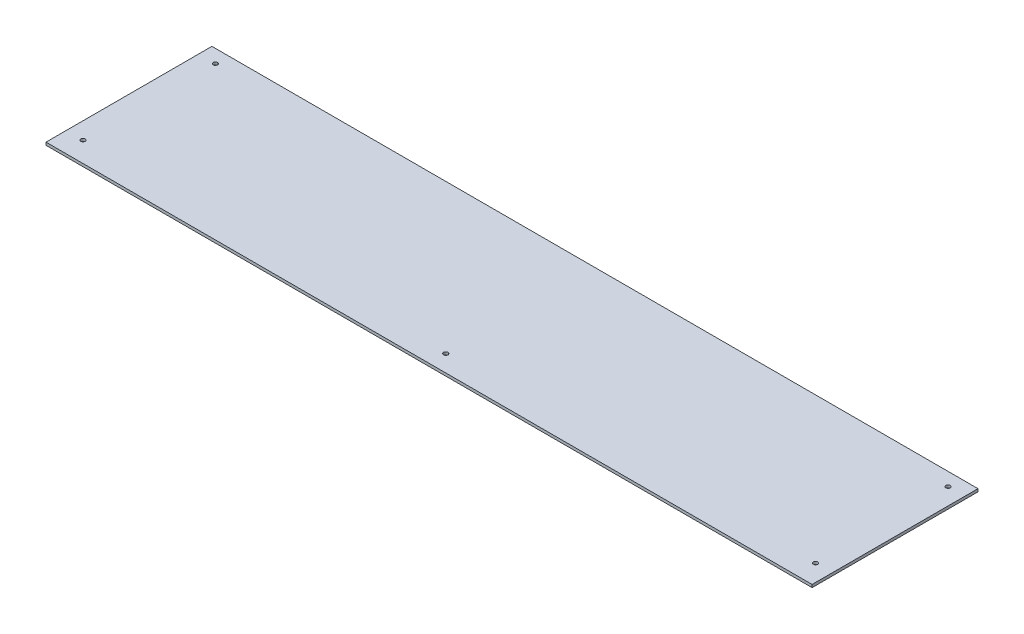
ISO-10303-21;
HEADER;
FILE_DESCRIPTION(('STEP AP214'),'2;1');
FILE_NAME('part.step','',(''),(''),'','','');
FILE_SCHEMA(('AUTOMOTIVE_DESIGN { 1 0 10303 214 1 1 1 1 }'));
ENDSEC;
DATA;
#1=APPLICATION_CONTEXT('core data for automotive mechanical design processes');
#2=APPLICATION_PROTOCOL_DEFINITION('international standard','automotive_design',2000,#1);
#3=PRODUCT_CONTEXT('',#1,'mechanical');
#4=PRODUCT('Part','Part','',(#3));
#5=PRODUCT_RELATED_PRODUCT_CATEGORY('part','',(#4));
#6=PRODUCT_DEFINITION_FORMATION('','',#4);
#7=PRODUCT_DEFINITION_CONTEXT('part definition',#1,'design');
#8=PRODUCT_DEFINITION('design','',#6,#7);
#9=PRODUCT_DEFINITION_SHAPE('','',#8);
#10=(LENGTH_UNIT() NAMED_UNIT(*) SI_UNIT(.MILLI.,.METRE.));
#11=(NAMED_UNIT(*) PLANE_ANGLE_UNIT() SI_UNIT($,.RADIAN.));
#12=(NAMED_UNIT(*) SI_UNIT($,.STERADIAN.) SOLID_ANGLE_UNIT());
#13=UNCERTAINTY_MEASURE_WITH_UNIT(LENGTH_MEASURE(1.E-05),#10,'distance_accuracy_value','');
#14=(GEOMETRIC_REPRESENTATION_CONTEXT(3) GLOBAL_UNCERTAINTY_ASSIGNED_CONTEXT((#13)) GLOBAL_UNIT_ASSIGNED_CONTEXT((#10,
#11,#12)) REPRESENTATION_CONTEXT('',''));
#15=CARTESIAN_POINT('',(0.,0.,0.));
#16=DIRECTION('',(0.,0.,1.));
#17=DIRECTION('',(1.,0.,0.));
#18=AXIS2_PLACEMENT_3D('',#15,#16,#17);
#19=CARTESIAN_POINT('',(0.,2.,0.));
#20=DIRECTION('',(0.,-1.,0.));
#21=DIRECTION('',(0.,0.,-1.));
#22=AXIS2_PLACEMENT_3D('',#19,#20,#21);
#23=PLANE('',#22);
#24=CARTESIAN_POINT('',(275.25,2.,-12.5));
#25=DIRECTION('',(0.,-1.,0.));
#26=DIRECTION('',(0.,0.,-1.));
#27=AXIS2_PLACEMENT_3D('',#24,#25,#26);
#28=CIRCLE('',#27,1.59999999999996);
#29=CARTESIAN_POINT('',(275.25,2.,-14.0999999999999));
#30=VERTEX_POINT('',#29);
#31=EDGE_CURVE('E101',#30,#30,#28,.F.);
#32=ORIENTED_EDGE('',*,*,#31,.F.);
#33=EDGE_LOOP('',(#32));
#34=FACE_BOUND('',#33,.T.);
#35=CARTESIAN_POINT('',(538.,2.,-110.));
#36=DIRECTION('',(0.,1.,0.));
#37=DIRECTION('',(0.,0.,-1.));
#38=AXIS2_PLACEMENT_3D('',#35,#36,#37);
#39=CIRCLE('',#38,1.54999999999999);
#40=CARTESIAN_POINT('',(538.,2.,-111.55));
#41=VERTEX_POINT('',#40);
#42=EDGE_CURVE('E111',#41,#41,#39,.T.);
#43=ORIENTED_EDGE('',*,*,#42,.F.);
#44=EDGE_LOOP('',(#43));
#45=FACE_BOUND('',#44,.T.);
#46=CARTESIAN_POINT('',(538.,2.,-15.));
#47=DIRECTION('',(0.,1.,0.));
#48=DIRECTION('',(0.,0.,-1.));
#49=AXIS2_PLACEMENT_3D('',#46,#47,#48);
#50=CIRCLE('',#49,1.54999999999999);
#51=CARTESIAN_POINT('',(538.,2.,-16.55));
#52=VERTEX_POINT('',#51);
#53=EDGE_CURVE('E119',#52,#52,#50,.T.);
#54=ORIENTED_EDGE('',*,*,#53,.F.);
#55=EDGE_LOOP('',(#54));
#56=FACE_BOUND('',#55,.T.);
#57=CARTESIAN_POINT('',(12.5,2.,-110.));
#58=DIRECTION('',(0.,1.,0.));
#59=DIRECTION('',(0.,0.,1.));
#60=AXIS2_PLACEMENT_3D('',#57,#58,#59);
#61=CIRCLE('',#60,1.54999999999999);
#62=CARTESIAN_POINT('',(12.5,2.,-108.45));
#63=VERTEX_POINT('',#62);
#64=EDGE_CURVE('E125',#63,#63,#61,.T.);
#65=ORIENTED_EDGE('',*,*,#64,.F.);
#66=EDGE_LOOP('',(#65));
#67=FACE_BOUND('',#66,.T.);
#68=CARTESIAN_POINT('',(12.5,2.,-15.));
#69=DIRECTION('',(0.,1.,0.));
#70=DIRECTION('',(0.,0.,1.));
#71=AXIS2_PLACEMENT_3D('',#68,#69,#70);
#72=CIRCLE('',#71,1.55);
#73=CARTESIAN_POINT('',(12.5,2.,-13.45));
#74=VERTEX_POINT('',#73);
#75=EDGE_CURVE('E11',#74,#74,#72,.T.);
#76=ORIENTED_EDGE('',*,*,#75,.F.);
#77=EDGE_LOOP('',(#76));
#78=FACE_BOUND('',#77,.T.);
#79=DIRECTION('',(1.,0.,0.));
#80=VECTOR('',#79,1.);
#81=CARTESIAN_POINT('',(550.,2.,-0.499999999999978));
#82=LINE('',#81,#80);
#83=CARTESIAN_POINT('',(0.500000000000056,2.,-0.5));
#84=VERTEX_POINT('',#83);
#85=CARTESIAN_POINT('',(550.,2.,-0.499999999999978));
#86=VERTEX_POINT('',#85);
#87=EDGE_CURVE('E83',#84,#86,#82,.T.);
#88=ORIENTED_EDGE('',*,*,#87,.T.);
#89=DIRECTION('',(0.,0.,-1.));
#90=VECTOR('',#89,1.);
#91=CARTESIAN_POINT('',(550.,2.,-119.5));
#92=LINE('',#91,#90);
#93=CARTESIAN_POINT('',(550.,2.,-119.5));
#94=VERTEX_POINT('',#93);
#95=EDGE_CURVE('E110',#86,#94,#92,.T.);
#96=ORIENTED_EDGE('',*,*,#95,.T.);
#97=DIRECTION('',(-1.,0.,0.));
#98=VECTOR('',#97,1.);
#99=CARTESIAN_POINT('',(0.5,2.,-119.5));
#100=LINE('',#99,#98);
#101=CARTESIAN_POINT('',(0.5,2.,-119.5));
#102=VERTEX_POINT('',#101);
#103=EDGE_CURVE('E166',#94,#102,#100,.T.);
#104=ORIENTED_EDGE('',*,*,#103,.T.);
#105=DIRECTION('',(0.,0.,1.));
#106=VECTOR('',#105,1.);
#107=CARTESIAN_POINT('',(0.5,2.,-0.5));
#108=LINE('',#107,#106);
#109=EDGE_CURVE('E118',#102,#84,#108,.T.);
#110=ORIENTED_EDGE('',*,*,#109,.T.);
#111=EDGE_LOOP('',(#88,#96,#104,#110));
#112=FACE_BOUND('',#111,.T.);
#113=ADVANCED_FACE('F39',(#34,#45,#56,#67,#78,#112),#23,.F.);
#114=CARTESIAN_POINT('',(0.,0.,0.));
#115=DIRECTION('',(0.,-1.,0.));
#116=DIRECTION('',(0.,0.,-1.));
#117=AXIS2_PLACEMENT_3D('',#114,#115,#116);
#118=PLANE('',#117);
#119=CARTESIAN_POINT('',(275.25,0.,-12.5));
#120=DIRECTION('',(0.,-1.,0.));
#121=DIRECTION('',(0.,0.,-1.));
#122=AXIS2_PLACEMENT_3D('',#119,#120,#121);
#123=CIRCLE('',#122,1.59999999999996);
#124=CARTESIAN_POINT('',(275.25,0.,-14.0999999999999));
#125=VERTEX_POINT('',#124);
#126=EDGE_CURVE('E172',#125,#125,#123,.T.);
#127=ORIENTED_EDGE('',*,*,#126,.F.);
#128=EDGE_LOOP('',(#127));
#129=FACE_BOUND('',#128,.T.);
#130=CARTESIAN_POINT('',(538.,0.,-110.));
#131=DIRECTION('',(0.,1.,0.));
#132=DIRECTION('',(0.,0.,-1.));
#133=AXIS2_PLACEMENT_3D('',#130,#131,#132);
#134=CIRCLE('',#133,1.54999999999999);
#135=CARTESIAN_POINT('',(538.,0.,-111.55));
#136=VERTEX_POINT('',#135);
#137=EDGE_CURVE('E115',#136,#136,#134,.T.);
#138=ORIENTED_EDGE('',*,*,#137,.T.);
#139=EDGE_LOOP('',(#138));
#140=FACE_BOUND('',#139,.T.);
#141=CARTESIAN_POINT('',(12.5,0.,-110.));
#142=DIRECTION('',(0.,1.,0.));
#143=DIRECTION('',(0.,0.,1.));
#144=AXIS2_PLACEMENT_3D('',#141,#142,#143);
#145=CIRCLE('',#144,1.54999999999999);
#146=CARTESIAN_POINT('',(12.5,0.,-108.45));
#147=VERTEX_POINT('',#146);
#148=EDGE_CURVE('E122',#147,#147,#145,.T.);
#149=ORIENTED_EDGE('',*,*,#148,.T.);
#150=EDGE_LOOP('',(#149));
#151=FACE_BOUND('',#150,.T.);
#152=CARTESIAN_POINT('',(12.5,0.,-15.));
#153=DIRECTION('',(0.,1.,0.));
#154=DIRECTION('',(0.,0.,1.));
#155=AXIS2_PLACEMENT_3D('',#152,#153,#154);
#156=CIRCLE('',#155,1.55);
#157=CARTESIAN_POINT('',(12.5,0.,-13.45));
#158=VERTEX_POINT('',#157);
#159=EDGE_CURVE('E43',#158,#158,#156,.T.);
#160=ORIENTED_EDGE('',*,*,#159,.T.);
#161=EDGE_LOOP('',(#160));
#162=FACE_BOUND('',#161,.T.);
#163=CARTESIAN_POINT('',(538.,0.,-15.));
#164=DIRECTION('',(0.,1.,0.));
#165=DIRECTION('',(0.,0.,-1.));
#166=AXIS2_PLACEMENT_3D('',#163,#164,#165);
#167=CIRCLE('',#166,1.54999999999999);
#168=CARTESIAN_POINT('',(538.,0.,-16.55));
#169=VERTEX_POINT('',#168);
#170=EDGE_CURVE('E114',#169,#169,#167,.T.);
#171=ORIENTED_EDGE('',*,*,#170,.T.);
#172=EDGE_LOOP('',(#171));
#173=FACE_BOUND('',#172,.T.);
#174=DIRECTION('',(0.,0.,1.));
#175=VECTOR('',#174,1.);
#176=CARTESIAN_POINT('',(550.,0.,-119.5));
#177=LINE('',#176,#175);
#178=CARTESIAN_POINT('',(550.,0.,-119.5));
#179=VERTEX_POINT('',#178);
#180=CARTESIAN_POINT('',(550.,0.,-0.499999999999978));
#181=VERTEX_POINT('',#180);
#182=EDGE_CURVE('E99',#179,#181,#177,.T.);
#183=ORIENTED_EDGE('',*,*,#182,.T.);
#184=DIRECTION('',(-1.,0.,0.));
#185=VECTOR('',#184,1.);
#186=CARTESIAN_POINT('',(550.,0.,-0.499999999999978));
#187=LINE('',#186,#185);
#188=CARTESIAN_POINT('',(0.5,0.,-0.5));
#189=VERTEX_POINT('',#188);
#190=EDGE_CURVE('E62',#181,#189,#187,.T.);
#191=ORIENTED_EDGE('',*,*,#190,.T.);
#192=DIRECTION('',(0.,0.,-1.));
#193=VECTOR('',#192,1.);
#194=CARTESIAN_POINT('',(0.5,0.,-0.5));
#195=LINE('',#194,#193);
#196=CARTESIAN_POINT('',(0.5,0.,-119.5));
#197=VERTEX_POINT('',#196);
#198=EDGE_CURVE('E90',#189,#197,#195,.T.);
#199=ORIENTED_EDGE('',*,*,#198,.T.);
#200=DIRECTION('',(1.,0.,0.));
#201=VECTOR('',#200,1.);
#202=CARTESIAN_POINT('',(0.5,0.,-119.5));
#203=LINE('',#202,#201);
#204=EDGE_CURVE('E96',#197,#179,#203,.T.);
#205=ORIENTED_EDGE('',*,*,#204,.T.);
#206=EDGE_LOOP('',(#183,#191,#199,#205));
#207=FACE_BOUND('',#206,.T.);
#208=ADVANCED_FACE('F41',(#129,#140,#151,#162,#173,#207),#118,.T.);
#209=CARTESIAN_POINT('',(12.5,2.,-15.));
#210=DIRECTION('',(0.,-1.,0.));
#211=DIRECTION('',(0.,0.,-1.));
#212=AXIS2_PLACEMENT_3D('',#209,#210,#211);
#213=CYLINDRICAL_SURFACE('',#212,1.55);
#214=ORIENTED_EDGE('',*,*,#75,.T.);
#215=EDGE_LOOP('',(#214));
#216=FACE_BOUND('',#215,.T.);
#217=ORIENTED_EDGE('',*,*,#159,.F.);
#218=EDGE_LOOP('',(#217));
#219=FACE_BOUND('',#218,.T.);
#220=ADVANCED_FACE('F136',(#216,#219),#213,.F.);
#221=CARTESIAN_POINT('',(12.5,2.,-110.));
#222=DIRECTION('',(0.,-1.,0.));
#223=DIRECTION('',(0.,0.,-1.));
#224=AXIS2_PLACEMENT_3D('',#221,#222,#223);
#225=CYLINDRICAL_SURFACE('',#224,1.54999999999999);
#226=ORIENTED_EDGE('',*,*,#64,.T.);
#227=EDGE_LOOP('',(#226));
#228=FACE_BOUND('',#227,.T.);
#229=ORIENTED_EDGE('',*,*,#148,.F.);
#230=EDGE_LOOP('',(#229));
#231=FACE_BOUND('',#230,.T.);
#232=ADVANCED_FACE('F133',(#228,#231),#225,.F.);
#233=CARTESIAN_POINT('',(538.,2.,-15.));
#234=DIRECTION('',(0.,-1.,0.));
#235=DIRECTION('',(0.,0.,-1.));
#236=AXIS2_PLACEMENT_3D('',#233,#234,#235);
#237=CYLINDRICAL_SURFACE('',#236,1.54999999999999);
#238=ORIENTED_EDGE('',*,*,#53,.T.);
#239=EDGE_LOOP('',(#238));
#240=FACE_BOUND('',#239,.T.);
#241=ORIENTED_EDGE('',*,*,#170,.F.);
#242=EDGE_LOOP('',(#241));
#243=FACE_BOUND('',#242,.T.);
#244=ADVANCED_FACE('F135',(#240,#243),#237,.F.);
#245=CARTESIAN_POINT('',(538.,2.,-110.));
#246=DIRECTION('',(0.,-1.,0.));
#247=DIRECTION('',(0.,0.,-1.));
#248=AXIS2_PLACEMENT_3D('',#245,#246,#247);
#249=CYLINDRICAL_SURFACE('',#248,1.54999999999999);
#250=ORIENTED_EDGE('',*,*,#42,.T.);
#251=EDGE_LOOP('',(#250));
#252=FACE_BOUND('',#251,.T.);
#253=ORIENTED_EDGE('',*,*,#137,.F.);
#254=EDGE_LOOP('',(#253));
#255=FACE_BOUND('',#254,.T.);
#256=ADVANCED_FACE('F143',(#252,#255),#249,.F.);
#257=CARTESIAN_POINT('',(550.,565.427235763412,-0.499999999999978));
#258=DIRECTION('',(0.,0.,1.));
#259=DIRECTION('',(1.,0.,0.));
#260=AXIS2_PLACEMENT_3D('',#257,#258,#259);
#261=PLANE('',#260);
#262=DIRECTION('',(0.,-1.,0.));
#263=VECTOR('',#262,1.);
#264=CARTESIAN_POINT('',(0.5,565.427235763412,-0.5));
#265=LINE('',#264,#263);
#266=EDGE_CURVE('E79',#84,#189,#265,.T.);
#267=ORIENTED_EDGE('',*,*,#266,.T.);
#268=ORIENTED_EDGE('',*,*,#190,.F.);
#269=DIRECTION('',(0.,-1.,0.));
#270=VECTOR('',#269,1.);
#271=CARTESIAN_POINT('',(550.,565.427235763412,-0.499999999999978));
#272=LINE('',#271,#270);
#273=EDGE_CURVE('E87',#86,#181,#272,.T.);
#274=ORIENTED_EDGE('',*,*,#273,.F.);
#275=ORIENTED_EDGE('',*,*,#87,.F.);
#276=EDGE_LOOP('',(#267,#268,#274,#275));
#277=FACE_BOUND('',#276,.T.);
#278=ADVANCED_FACE('F81',(#277),#261,.T.);
#279=CARTESIAN_POINT('',(0.5,565.427235763412,-0.5));
#280=DIRECTION('',(-1.,0.,0.));
#281=DIRECTION('',(0.,0.,1.));
#282=AXIS2_PLACEMENT_3D('',#279,#280,#281);
#283=PLANE('',#282);
#284=DIRECTION('',(0.,-1.,0.));
#285=VECTOR('',#284,1.);
#286=CARTESIAN_POINT('',(0.5,565.427235763412,-119.5));
#287=LINE('',#286,#285);
#288=EDGE_CURVE('E86',#102,#197,#287,.T.);
#289=ORIENTED_EDGE('',*,*,#288,.T.);
#290=ORIENTED_EDGE('',*,*,#198,.F.);
#291=ORIENTED_EDGE('',*,*,#266,.F.);
#292=ORIENTED_EDGE('',*,*,#109,.F.);
#293=EDGE_LOOP('',(#289,#290,#291,#292));
#294=FACE_BOUND('',#293,.T.);
#295=ADVANCED_FACE('F91',(#294),#283,.T.);
#296=CARTESIAN_POINT('',(0.5,565.427235763412,-119.5));
#297=DIRECTION('',(0.,0.,-1.));
#298=DIRECTION('',(-1.,0.,0.));
#299=AXIS2_PLACEMENT_3D('',#296,#297,#298);
#300=PLANE('',#299);
#301=DIRECTION('',(0.,-1.,0.));
#302=VECTOR('',#301,1.);
#303=CARTESIAN_POINT('',(550.,565.427235763412,-119.5));
#304=LINE('',#303,#302);
#305=EDGE_CURVE('E54',#94,#179,#304,.T.);
#306=ORIENTED_EDGE('',*,*,#305,.T.);
#307=ORIENTED_EDGE('',*,*,#204,.F.);
#308=ORIENTED_EDGE('',*,*,#288,.F.);
#309=ORIENTED_EDGE('',*,*,#103,.F.);
#310=EDGE_LOOP('',(#306,#307,#308,#309));
#311=FACE_BOUND('',#310,.T.);
#312=ADVANCED_FACE('F191',(#311),#300,.T.);
#313=CARTESIAN_POINT('',(550.,565.427235763412,-119.5));
#314=DIRECTION('',(1.,0.,0.));
#315=DIRECTION('',(0.,0.,-1.));
#316=AXIS2_PLACEMENT_3D('',#313,#314,#315);
#317=PLANE('',#316);
#318=ORIENTED_EDGE('',*,*,#273,.T.);
#319=ORIENTED_EDGE('',*,*,#182,.F.);
#320=ORIENTED_EDGE('',*,*,#305,.F.);
#321=ORIENTED_EDGE('',*,*,#95,.F.);
#322=EDGE_LOOP('',(#318,#319,#320,#321));
#323=FACE_BOUND('',#322,.T.);
#324=ADVANCED_FACE('F189',(#323),#317,.T.);
#325=CARTESIAN_POINT('',(275.25,6.52548339959384,-12.5));
#326=DIRECTION('',(0.,-1.,0.));
#327=DIRECTION('',(0.,0.,-1.));
#328=AXIS2_PLACEMENT_3D('',#325,#326,#327);
#329=CYLINDRICAL_SURFACE('',#328,1.59999999999996);
#330=ORIENTED_EDGE('',*,*,#31,.T.);
#331=EDGE_LOOP('',(#330));
#332=FACE_BOUND('',#331,.T.);
#333=ORIENTED_EDGE('',*,*,#126,.T.);
#334=EDGE_LOOP('',(#333));
#335=FACE_BOUND('',#334,.T.);
#336=ADVANCED_FACE('F177',(#332,#335),#329,.F.);
#337=CLOSED_SHELL('',(#113,#208,#220,#232,#244,#256,#278,#295,#312,#324,#336));
#338=MANIFOLD_SOLID_BREP('B2',#337);
#339=ADVANCED_BREP_SHAPE_REPRESENTATION('',(#18,#338),#14);
#340=SHAPE_DEFINITION_REPRESENTATION(#9,#339);
ENDSEC;
END-ISO-10303-21;
